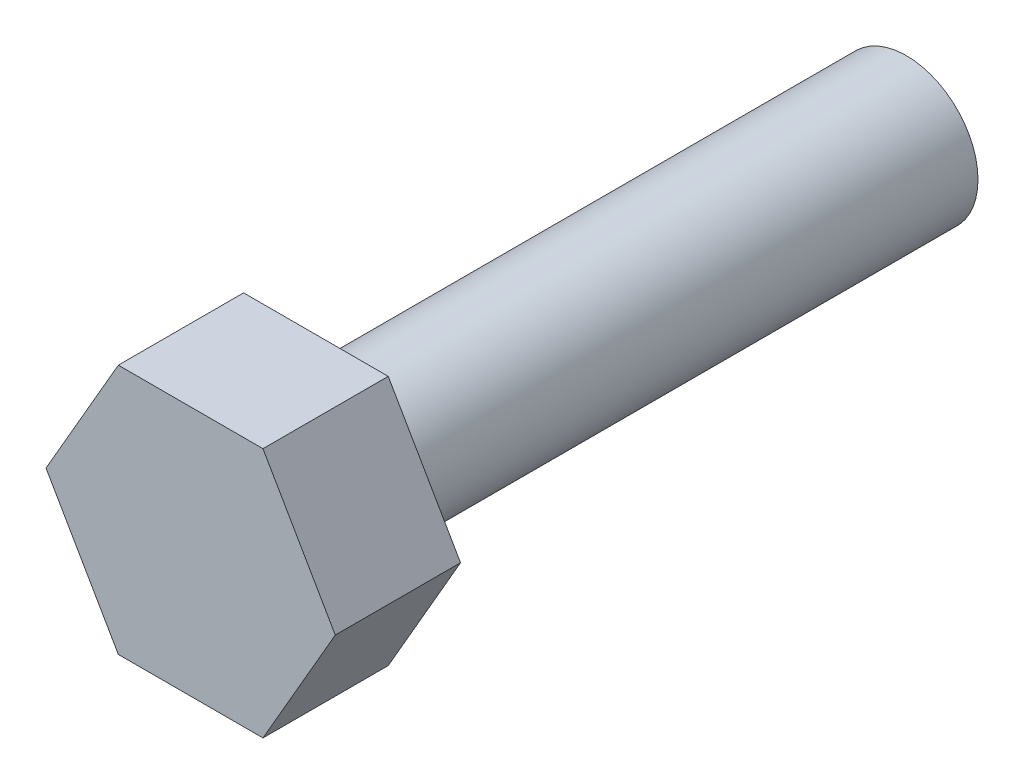
ISO-10303-21;
HEADER;
FILE_DESCRIPTION(('STEP AP214'),'2;1');
FILE_NAME('part.step','',(''),(''),'','','');
FILE_SCHEMA(('AUTOMOTIVE_DESIGN { 1 0 10303 214 1 1 1 1 }'));
ENDSEC;
DATA;
#1=APPLICATION_CONTEXT('core data for automotive mechanical design processes');
#2=APPLICATION_PROTOCOL_DEFINITION('international standard','automotive_design',2000,#1);
#3=PRODUCT_CONTEXT('',#1,'mechanical');
#4=PRODUCT('Part','Part','',(#3));
#5=PRODUCT_RELATED_PRODUCT_CATEGORY('part','',(#4));
#6=PRODUCT_DEFINITION_FORMATION('','',#4);
#7=PRODUCT_DEFINITION_CONTEXT('part definition',#1,'design');
#8=PRODUCT_DEFINITION('design','',#6,#7);
#9=PRODUCT_DEFINITION_SHAPE('','',#8);
#10=(LENGTH_UNIT() NAMED_UNIT(*) SI_UNIT(.MILLI.,.METRE.));
#11=(NAMED_UNIT(*) PLANE_ANGLE_UNIT() SI_UNIT($,.RADIAN.));
#12=(NAMED_UNIT(*) SI_UNIT($,.STERADIAN.) SOLID_ANGLE_UNIT());
#13=UNCERTAINTY_MEASURE_WITH_UNIT(LENGTH_MEASURE(1.E-05),#10,'distance_accuracy_value','');
#14=(GEOMETRIC_REPRESENTATION_CONTEXT(3) GLOBAL_UNCERTAINTY_ASSIGNED_CONTEXT((#13)) GLOBAL_UNIT_ASSIGNED_CONTEXT((#10,
#11,#12)) REPRESENTATION_CONTEXT('',''));
#15=CARTESIAN_POINT('',(0.,0.,0.));
#16=DIRECTION('',(0.,0.,1.));
#17=DIRECTION('',(1.,0.,0.));
#18=AXIS2_PLACEMENT_3D('',#15,#16,#17);
#19=CARTESIAN_POINT('',(-205.305755723831,4.71844785465692E-13,838.2));
#20=DIRECTION('',(-0.86602540378444,-0.499999999999998,0.));
#21=DIRECTION('',(0.499999999999998,-0.86602540378444,0.));
#22=AXIS2_PLACEMENT_3D('',#19,#20,#21);
#23=PLANE('',#22);
#24=DIRECTION('',(0.499999999999998,-0.86602540378444,0.));
#25=VECTOR('',#24,1.);
#26=CARTESIAN_POINT('',(-205.305755723831,4.71844785465692E-13,1016.));
#27=LINE('',#26,#25);
#28=CARTESIAN_POINT('',(-205.305755723831,4.71844785465692E-13,1016.));
#29=VERTEX_POINT('',#28);
#30=CARTESIAN_POINT('',(-102.652877861916,-177.8,1016.));
#31=VERTEX_POINT('',#30);
#32=EDGE_CURVE('E117',#29,#31,#27,.T.);
#33=ORIENTED_EDGE('',*,*,#32,.F.);
#34=DIRECTION('',(0.,0.,1.));
#35=VECTOR('',#34,1.);
#36=CARTESIAN_POINT('',(-205.305755723831,4.71844785465692E-13,838.2));
#37=LINE('',#36,#35);
#38=CARTESIAN_POINT('',(-205.305755723831,4.71844785465692E-13,838.2));
#39=VERTEX_POINT('',#38);
#40=EDGE_CURVE('E11',#39,#29,#37,.T.);
#41=ORIENTED_EDGE('',*,*,#40,.F.);
#42=DIRECTION('',(0.499999999999998,-0.86602540378444,0.));
#43=VECTOR('',#42,1.);
#44=CARTESIAN_POINT('',(-205.305755723831,4.71844785465692E-13,838.2));
#45=LINE('',#44,#43);
#46=CARTESIAN_POINT('',(-102.652877861916,-177.8,838.2));
#47=VERTEX_POINT('',#46);
#48=EDGE_CURVE('E132',#39,#47,#45,.T.);
#49=ORIENTED_EDGE('',*,*,#48,.T.);
#50=DIRECTION('',(0.,0.,1.));
#51=VECTOR('',#50,1.);
#52=CARTESIAN_POINT('',(-102.652877861916,-177.8,838.2));
#53=LINE('',#52,#51);
#54=EDGE_CURVE('E35',#47,#31,#53,.T.);
#55=ORIENTED_EDGE('',*,*,#54,.T.);
#56=EDGE_LOOP('',(#33,#41,#49,#55));
#57=FACE_BOUND('',#56,.T.);
#58=ADVANCED_FACE('F32',(#57),#23,.T.);
#59=CARTESIAN_POINT('',(-102.652877861915,177.8,838.2));
#60=DIRECTION('',(-0.866025403784438,0.500000000000002,0.));
#61=DIRECTION('',(-0.500000000000002,-0.866025403784438,0.));
#62=AXIS2_PLACEMENT_3D('',#59,#60,#61);
#63=PLANE('',#62);
#64=DIRECTION('',(-0.500000000000002,-0.866025403784438,0.));
#65=VECTOR('',#64,1.);
#66=CARTESIAN_POINT('',(-102.652877861915,177.8,1016.));
#67=LINE('',#66,#65);
#68=CARTESIAN_POINT('',(-102.652877861915,177.8,1016.));
#69=VERTEX_POINT('',#68);
#70=EDGE_CURVE('E130',#69,#29,#67,.T.);
#71=ORIENTED_EDGE('',*,*,#70,.F.);
#72=DIRECTION('',(0.,0.,1.));
#73=VECTOR('',#72,1.);
#74=CARTESIAN_POINT('',(-102.652877861915,177.8,838.2));
#75=LINE('',#74,#73);
#76=CARTESIAN_POINT('',(-102.652877861915,177.8,838.2));
#77=VERTEX_POINT('',#76);
#78=EDGE_CURVE('E41',#77,#69,#75,.T.);
#79=ORIENTED_EDGE('',*,*,#78,.F.);
#80=DIRECTION('',(-0.500000000000002,-0.866025403784438,0.));
#81=VECTOR('',#80,1.);
#82=CARTESIAN_POINT('',(-102.652877861915,177.8,838.2));
#83=LINE('',#82,#81);
#84=EDGE_CURVE('E107',#77,#39,#83,.T.);
#85=ORIENTED_EDGE('',*,*,#84,.T.);
#86=ORIENTED_EDGE('',*,*,#40,.T.);
#87=EDGE_LOOP('',(#71,#79,#85,#86));
#88=FACE_BOUND('',#87,.T.);
#89=ADVANCED_FACE('F140',(#88),#63,.T.);
#90=CARTESIAN_POINT('',(102.652877861916,177.8,838.2));
#91=DIRECTION('',(0.,1.,0.));
#92=DIRECTION('',(-1.,0.,0.));
#93=AXIS2_PLACEMENT_3D('',#90,#91,#92);
#94=PLANE('',#93);
#95=DIRECTION('',(-1.,0.,0.));
#96=VECTOR('',#95,1.);
#97=CARTESIAN_POINT('',(102.652877861916,177.8,1016.));
#98=LINE('',#97,#96);
#99=CARTESIAN_POINT('',(102.652877861916,177.8,1016.));
#100=VERTEX_POINT('',#99);
#101=EDGE_CURVE('E94',#100,#69,#98,.T.);
#102=ORIENTED_EDGE('',*,*,#101,.F.);
#103=DIRECTION('',(0.,0.,1.));
#104=VECTOR('',#103,1.);
#105=CARTESIAN_POINT('',(102.652877861916,177.8,838.2));
#106=LINE('',#105,#104);
#107=CARTESIAN_POINT('',(102.652877861916,177.8,838.2));
#108=VERTEX_POINT('',#107);
#109=EDGE_CURVE('E89',#108,#100,#106,.T.);
#110=ORIENTED_EDGE('',*,*,#109,.F.);
#111=DIRECTION('',(-1.,0.,0.));
#112=VECTOR('',#111,1.);
#113=CARTESIAN_POINT('',(102.652877861916,177.8,838.2));
#114=LINE('',#113,#112);
#115=EDGE_CURVE('E92',#108,#77,#114,.T.);
#116=ORIENTED_EDGE('',*,*,#115,.T.);
#117=ORIENTED_EDGE('',*,*,#78,.T.);
#118=EDGE_LOOP('',(#102,#110,#116,#117));
#119=FACE_BOUND('',#118,.T.);
#120=ADVANCED_FACE('F91',(#119),#94,.T.);
#121=CARTESIAN_POINT('',(205.305755723831,0.,838.2));
#122=DIRECTION('',(0.866025403784439,0.5,0.));
#123=DIRECTION('',(-0.5,0.866025403784439,0.));
#124=AXIS2_PLACEMENT_3D('',#121,#122,#123);
#125=PLANE('',#124);
#126=DIRECTION('',(-0.5,0.866025403784439,0.));
#127=VECTOR('',#126,1.);
#128=CARTESIAN_POINT('',(205.305755723831,0.,1016.));
#129=LINE('',#128,#127);
#130=CARTESIAN_POINT('',(205.305755723831,0.,1016.));
#131=VERTEX_POINT('',#130);
#132=EDGE_CURVE('E127',#131,#100,#129,.T.);
#133=ORIENTED_EDGE('',*,*,#132,.F.);
#134=DIRECTION('',(0.,0.,1.));
#135=VECTOR('',#134,1.);
#136=CARTESIAN_POINT('',(205.305755723831,0.,838.2));
#137=LINE('',#136,#135);
#138=CARTESIAN_POINT('',(205.305755723831,0.,838.2));
#139=VERTEX_POINT('',#138);
#140=EDGE_CURVE('E99',#139,#131,#137,.T.);
#141=ORIENTED_EDGE('',*,*,#140,.F.);
#142=DIRECTION('',(-0.5,0.866025403784439,0.));
#143=VECTOR('',#142,1.);
#144=CARTESIAN_POINT('',(205.305755723831,0.,838.2));
#145=LINE('',#144,#143);
#146=EDGE_CURVE('E105',#139,#108,#145,.T.);
#147=ORIENTED_EDGE('',*,*,#146,.T.);
#148=ORIENTED_EDGE('',*,*,#109,.T.);
#149=EDGE_LOOP('',(#133,#141,#147,#148));
#150=FACE_BOUND('',#149,.T.);
#151=ADVANCED_FACE('F109',(#150),#125,.T.);
#152=CARTESIAN_POINT('',(102.652877861915,-177.8,838.2));
#153=DIRECTION('',(0.866025403784437,-0.500000000000002,0.));
#154=DIRECTION('',(0.500000000000002,0.866025403784438,0.));
#155=AXIS2_PLACEMENT_3D('',#152,#153,#154);
#156=PLANE('',#155);
#157=DIRECTION('',(0.500000000000002,0.866025403784438,0.));
#158=VECTOR('',#157,1.);
#159=CARTESIAN_POINT('',(102.652877861915,-177.8,1016.));
#160=LINE('',#159,#158);
#161=CARTESIAN_POINT('',(102.652877861915,-177.8,1016.));
#162=VERTEX_POINT('',#161);
#163=EDGE_CURVE('E124',#162,#131,#160,.T.);
#164=ORIENTED_EDGE('',*,*,#163,.F.);
#165=DIRECTION('',(0.,0.,1.));
#166=VECTOR('',#165,1.);
#167=CARTESIAN_POINT('',(102.652877861915,-177.8,838.2));
#168=LINE('',#167,#166);
#169=CARTESIAN_POINT('',(102.652877861915,-177.8,838.2));
#170=VERTEX_POINT('',#169);
#171=EDGE_CURVE('E135',#170,#162,#168,.T.);
#172=ORIENTED_EDGE('',*,*,#171,.F.);
#173=DIRECTION('',(0.500000000000002,0.866025403784438,0.));
#174=VECTOR('',#173,1.);
#175=CARTESIAN_POINT('',(102.652877861915,-177.8,838.2));
#176=LINE('',#175,#174);
#177=EDGE_CURVE('E110',#170,#139,#176,.T.);
#178=ORIENTED_EDGE('',*,*,#177,.T.);
#179=ORIENTED_EDGE('',*,*,#140,.T.);
#180=EDGE_LOOP('',(#164,#172,#178,#179));
#181=FACE_BOUND('',#180,.T.);
#182=ADVANCED_FACE('F153',(#181),#156,.T.);
#183=CARTESIAN_POINT('',(-102.652877861916,-177.8,838.2));
#184=DIRECTION('',(0.,-1.,0.));
#185=DIRECTION('',(1.,0.,0.));
#186=AXIS2_PLACEMENT_3D('',#183,#184,#185);
#187=PLANE('',#186);
#188=DIRECTION('',(1.,0.,0.));
#189=VECTOR('',#188,1.);
#190=CARTESIAN_POINT('',(-102.652877861916,-177.8,1016.));
#191=LINE('',#190,#189);
#192=EDGE_CURVE('E120',#31,#162,#191,.T.);
#193=ORIENTED_EDGE('',*,*,#192,.F.);
#194=ORIENTED_EDGE('',*,*,#54,.F.);
#195=DIRECTION('',(1.,0.,0.));
#196=VECTOR('',#195,1.);
#197=CARTESIAN_POINT('',(-102.652877861916,-177.8,838.2));
#198=LINE('',#197,#196);
#199=EDGE_CURVE('E112',#47,#170,#198,.T.);
#200=ORIENTED_EDGE('',*,*,#199,.T.);
#201=ORIENTED_EDGE('',*,*,#171,.T.);
#202=EDGE_LOOP('',(#193,#194,#200,#201));
#203=FACE_BOUND('',#202,.T.);
#204=ADVANCED_FACE('F137',(#203),#187,.T.);
#205=CARTESIAN_POINT('',(0.,0.,838.2));
#206=DIRECTION('',(0.,0.,1.));
#207=DIRECTION('',(1.,0.,0.));
#208=AXIS2_PLACEMENT_3D('',#205,#206,#207);
#209=PLANE('',#208);
#210=CARTESIAN_POINT('',(0.,0.,838.2));
#211=DIRECTION('',(0.,0.,1.));
#212=DIRECTION('',(1.,0.,0.));
#213=AXIS2_PLACEMENT_3D('',#210,#211,#212);
#214=CIRCLE('',#213,101.6);
#215=CARTESIAN_POINT('',(101.6,0.,838.2));
#216=VERTEX_POINT('',#215);
#217=EDGE_CURVE('E177',#216,#216,#214,.T.);
#218=ORIENTED_EDGE('',*,*,#217,.T.);
#219=EDGE_LOOP('',(#218));
#220=FACE_BOUND('',#219,.T.);
#221=ORIENTED_EDGE('',*,*,#48,.F.);
#222=ORIENTED_EDGE('',*,*,#84,.F.);
#223=ORIENTED_EDGE('',*,*,#115,.F.);
#224=ORIENTED_EDGE('',*,*,#146,.F.);
#225=ORIENTED_EDGE('',*,*,#177,.F.);
#226=ORIENTED_EDGE('',*,*,#199,.F.);
#227=EDGE_LOOP('',(#221,#222,#223,#224,#225,#226));
#228=FACE_BOUND('',#227,.T.);
#229=ADVANCED_FACE('F103',(#220,#228),#209,.F.);
#230=CARTESIAN_POINT('',(0.,0.,1016.));
#231=DIRECTION('',(0.,0.,1.));
#232=DIRECTION('',(1.,0.,0.));
#233=AXIS2_PLACEMENT_3D('',#230,#231,#232);
#234=PLANE('',#233);
#235=ORIENTED_EDGE('',*,*,#32,.T.);
#236=ORIENTED_EDGE('',*,*,#192,.T.);
#237=ORIENTED_EDGE('',*,*,#163,.T.);
#238=ORIENTED_EDGE('',*,*,#132,.T.);
#239=ORIENTED_EDGE('',*,*,#101,.T.);
#240=ORIENTED_EDGE('',*,*,#70,.T.);
#241=EDGE_LOOP('',(#235,#236,#237,#238,#239,#240));
#242=FACE_BOUND('',#241,.T.);
#243=ADVANCED_FACE('F139',(#242),#234,.T.);
#244=CARTESIAN_POINT('',(0.,0.,0.));
#245=DIRECTION('',(0.,0.,1.));
#246=DIRECTION('',(1.,0.,0.));
#247=AXIS2_PLACEMENT_3D('',#244,#245,#246);
#248=CYLINDRICAL_SURFACE('',#247,101.6);
#249=CARTESIAN_POINT('',(0.,0.,0.));
#250=DIRECTION('',(0.,0.,1.));
#251=DIRECTION('',(1.,0.,0.));
#252=AXIS2_PLACEMENT_3D('',#249,#250,#251);
#253=CIRCLE('',#252,101.6);
#254=CARTESIAN_POINT('',(101.6,0.,0.));
#255=VERTEX_POINT('',#254);
#256=EDGE_CURVE('E121',#255,#255,#253,.T.);
#257=ORIENTED_EDGE('',*,*,#256,.T.);
#258=EDGE_LOOP('',(#257));
#259=FACE_BOUND('',#258,.T.);
#260=ORIENTED_EDGE('',*,*,#217,.F.);
#261=EDGE_LOOP('',(#260));
#262=FACE_BOUND('',#261,.T.);
#263=ADVANCED_FACE('F164',(#259,#262),#248,.T.);
#264=CARTESIAN_POINT('',(101.6,0.,0.));
#265=DIRECTION('',(0.,0.,-1.));
#266=DIRECTION('',(-1.,0.,0.));
#267=AXIS2_PLACEMENT_3D('',#264,#265,#266);
#268=PLANE('',#267);
#269=ORIENTED_EDGE('',*,*,#256,.F.);
#270=EDGE_LOOP('',(#269));
#271=FACE_BOUND('',#270,.T.);
#272=ADVANCED_FACE('F169',(#271),#268,.T.);
#273=CLOSED_SHELL('',(#58,#89,#120,#151,#182,#204,#229,#243,#263,#272));
#274=MANIFOLD_SOLID_BREP('B2',#273);
#275=ADVANCED_BREP_SHAPE_REPRESENTATION('',(#18,#274),#14);
#276=SHAPE_DEFINITION_REPRESENTATION(#9,#275);
ENDSEC;
END-ISO-10303-21;
